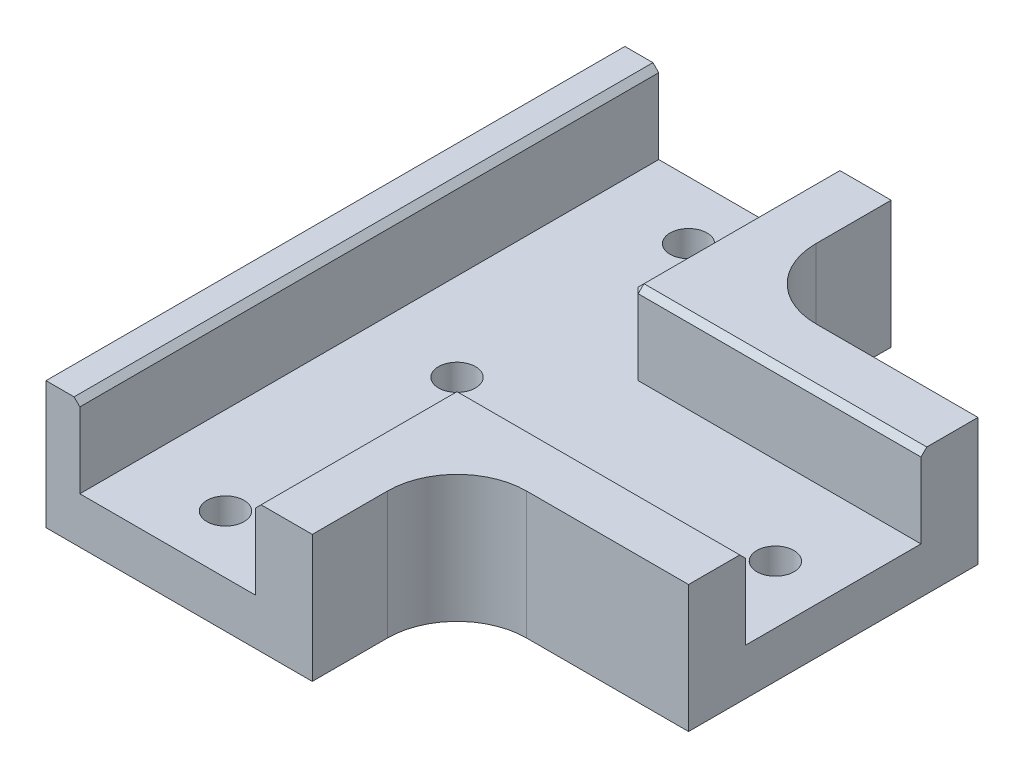
ISO-10303-21;
HEADER;
FILE_DESCRIPTION(('STEP AP214'),'2;1');
FILE_NAME('part.step','',(''),(''),'','','');
FILE_SCHEMA(('AUTOMOTIVE_DESIGN { 1 0 10303 214 1 1 1 1 }'));
ENDSEC;
DATA;
#1=APPLICATION_CONTEXT('core data for automotive mechanical design processes');
#2=APPLICATION_PROTOCOL_DEFINITION('international standard','automotive_design',2000,#1);
#3=PRODUCT_CONTEXT('',#1,'mechanical');
#4=PRODUCT('Part','Part','',(#3));
#5=PRODUCT_RELATED_PRODUCT_CATEGORY('part','',(#4));
#6=PRODUCT_DEFINITION_FORMATION('','',#4);
#7=PRODUCT_DEFINITION_CONTEXT('part definition',#1,'design');
#8=PRODUCT_DEFINITION('design','',#6,#7);
#9=PRODUCT_DEFINITION_SHAPE('','',#8);
#10=(LENGTH_UNIT() NAMED_UNIT(*) SI_UNIT(.MILLI.,.METRE.));
#11=(NAMED_UNIT(*) PLANE_ANGLE_UNIT() SI_UNIT($,.RADIAN.));
#12=(NAMED_UNIT(*) SI_UNIT($,.STERADIAN.) SOLID_ANGLE_UNIT());
#13=UNCERTAINTY_MEASURE_WITH_UNIT(LENGTH_MEASURE(1.E-05),#10,'distance_accuracy_value','');
#14=(GEOMETRIC_REPRESENTATION_CONTEXT(3) GLOBAL_UNCERTAINTY_ASSIGNED_CONTEXT((#13)) GLOBAL_UNIT_ASSIGNED_CONTEXT((#10,
#11,#12)) REPRESENTATION_CONTEXT('',''));
#15=CARTESIAN_POINT('',(0.,0.,0.));
#16=DIRECTION('',(0.,0.,1.));
#17=DIRECTION('',(1.,0.,0.));
#18=AXIS2_PLACEMENT_3D('',#15,#16,#17);
#19=CARTESIAN_POINT('',(0.,4.,0.));
#20=DIRECTION('',(0.,-1.,0.));
#21=DIRECTION('',(0.,0.,-1.));
#22=AXIS2_PLACEMENT_3D('',#19,#20,#21);
#23=PLANE('',#22);
#24=CARTESIAN_POINT('',(0.,4.,-20.));
#25=DIRECTION('',(0.,1.,0.));
#26=DIRECTION('',(0.,0.,1.));
#27=AXIS2_PLACEMENT_3D('',#24,#25,#26);
#28=CIRCLE('',#27,1.6);
#29=CARTESIAN_POINT('',(0.,4.,-18.4));
#30=VERTEX_POINT('',#29);
#31=EDGE_CURVE('E802',#30,#30,#28,.T.);
#32=ORIENTED_EDGE('',*,*,#31,.F.);
#33=EDGE_LOOP('',(#32));
#34=FACE_BOUND('',#33,.T.);
#35=CARTESIAN_POINT('',(0.,4.,20.));
#36=DIRECTION('',(0.,1.,0.));
#37=DIRECTION('',(0.,0.,1.));
#38=AXIS2_PLACEMENT_3D('',#35,#36,#37);
#39=CIRCLE('',#38,1.6);
#40=CARTESIAN_POINT('',(0.,4.,21.6));
#41=VERTEX_POINT('',#40);
#42=EDGE_CURVE('E808',#41,#41,#39,.T.);
#43=ORIENTED_EDGE('',*,*,#42,.F.);
#44=EDGE_LOOP('',(#43));
#45=FACE_BOUND('',#44,.T.);
#46=CARTESIAN_POINT('',(27.5,4.,0.));
#47=DIRECTION('',(0.,1.,0.));
#48=DIRECTION('',(0.,0.,1.));
#49=AXIS2_PLACEMENT_3D('',#46,#47,#48);
#50=CIRCLE('',#49,1.6);
#51=CARTESIAN_POINT('',(27.5,4.,1.6));
#52=VERTEX_POINT('',#51);
#53=EDGE_CURVE('E365',#52,#52,#50,.T.);
#54=ORIENTED_EDGE('',*,*,#53,.F.);
#55=EDGE_LOOP('',(#54));
#56=FACE_BOUND('',#55,.T.);
#57=CARTESIAN_POINT('',(0.,4.,0.));
#58=DIRECTION('',(0.,1.,0.));
#59=DIRECTION('',(0.,0.,1.));
#60=AXIS2_PLACEMENT_3D('',#57,#58,#59);
#61=CIRCLE('',#60,1.6);
#62=CARTESIAN_POINT('',(0.,4.,1.6));
#63=VERTEX_POINT('',#62);
#64=EDGE_CURVE('E805',#63,#63,#61,.T.);
#65=ORIENTED_EDGE('',*,*,#64,.F.);
#66=EDGE_LOOP('',(#65));
#67=FACE_BOUND('',#66,.T.);
#68=DIRECTION('',(0.,0.,-1.));
#69=VECTOR('',#68,1.);
#70=CARTESIAN_POINT('',(-7.57500000000001,4.,-25.));
#71=LINE('',#70,#69);
#72=CARTESIAN_POINT('',(-7.575,4.,25.));
#73=VERTEX_POINT('',#72);
#74=CARTESIAN_POINT('',(-7.575,4.,-25.));
#75=VERTEX_POINT('',#74);
#76=EDGE_CURVE('E206',#73,#75,#71,.T.);
#77=ORIENTED_EDGE('',*,*,#76,.F.);
#78=DIRECTION('',(1.,0.,0.));
#79=VECTOR('',#78,1.);
#80=CARTESIAN_POINT('',(12.5,4.,25.));
#81=LINE('',#80,#79);
#82=CARTESIAN_POINT('',(7.57500000000001,4.,25.));
#83=VERTEX_POINT('',#82);
#84=EDGE_CURVE('E280',#73,#83,#81,.T.);
#85=ORIENTED_EDGE('',*,*,#84,.T.);
#86=DIRECTION('',(0.,0.,1.));
#87=VECTOR('',#86,1.);
#88=CARTESIAN_POINT('',(7.57500000000001,4.,25.));
#89=LINE('',#88,#87);
#90=CARTESIAN_POINT('',(7.575,4.,8.07500000000001));
#91=VERTEX_POINT('',#90);
#92=EDGE_CURVE('E257',#91,#83,#89,.T.);
#93=ORIENTED_EDGE('',*,*,#92,.F.);
#94=DIRECTION('',(-0.707106781186548,0.,0.707106781186548));
#95=VECTOR('',#94,1.);
#96=CARTESIAN_POINT('',(7.825,4.,7.825));
#97=LINE('',#96,#95);
#98=CARTESIAN_POINT('',(8.07500000000001,4.,7.575));
#99=VERTEX_POINT('',#98);
#100=EDGE_CURVE('E350',#91,#99,#97,.F.);
#101=ORIENTED_EDGE('',*,*,#100,.T.);
#102=DIRECTION('',(-1.,0.,0.));
#103=VECTOR('',#102,1.);
#104=CARTESIAN_POINT('',(7.575,4.,7.575));
#105=LINE('',#104,#103);
#106=CARTESIAN_POINT('',(32.5,4.,7.57500000000001));
#107=VERTEX_POINT('',#106);
#108=EDGE_CURVE('E253',#107,#99,#105,.T.);
#109=ORIENTED_EDGE('',*,*,#108,.F.);
#110=DIRECTION('',(0.,0.,-1.));
#111=VECTOR('',#110,1.);
#112=CARTESIAN_POINT('',(32.5,4.,-12.5));
#113=LINE('',#112,#111);
#114=CARTESIAN_POINT('',(32.5,4.,-7.575));
#115=VERTEX_POINT('',#114);
#116=EDGE_CURVE('E273',#107,#115,#113,.T.);
#117=ORIENTED_EDGE('',*,*,#116,.T.);
#118=DIRECTION('',(1.,0.,0.));
#119=VECTOR('',#118,1.);
#120=CARTESIAN_POINT('',(32.5,4.,-7.57500000000001));
#121=LINE('',#120,#119);
#122=CARTESIAN_POINT('',(8.07500000000001,4.,-7.575));
#123=VERTEX_POINT('',#122);
#124=EDGE_CURVE('E237',#123,#115,#121,.T.);
#125=ORIENTED_EDGE('',*,*,#124,.F.);
#126=DIRECTION('',(0.707106781186546,0.,0.707106781186549));
#127=VECTOR('',#126,1.);
#128=CARTESIAN_POINT('',(7.82500000000002,4.,-7.82499999999999));
#129=LINE('',#128,#127);
#130=CARTESIAN_POINT('',(7.575,4.,-8.07500000000001));
#131=VERTEX_POINT('',#130);
#132=EDGE_CURVE('E352',#123,#131,#129,.F.);
#133=ORIENTED_EDGE('',*,*,#132,.T.);
#134=DIRECTION('',(0.,0.,1.));
#135=VECTOR('',#134,1.);
#136=CARTESIAN_POINT('',(7.575,4.,-7.575));
#137=LINE('',#136,#135);
#138=CARTESIAN_POINT('',(7.575,4.,-25.));
#139=VERTEX_POINT('',#138);
#140=EDGE_CURVE('E233',#139,#131,#137,.T.);
#141=ORIENTED_EDGE('',*,*,#140,.F.);
#142=DIRECTION('',(-1.,0.,0.));
#143=VECTOR('',#142,1.);
#144=CARTESIAN_POINT('',(-10.5,4.,-25.));
#145=LINE('',#144,#143);
#146=EDGE_CURVE('E276',#139,#75,#145,.T.);
#147=ORIENTED_EDGE('',*,*,#146,.T.);
#148=EDGE_LOOP('',(#77,#85,#93,#101,#109,#117,#125,#133,#141,#147));
#149=FACE_BOUND('',#148,.T.);
#150=ADVANCED_FACE('F34',(#34,#45,#56,#67,#149),#23,.F.);
#151=CARTESIAN_POINT('',(32.5,4.,-12.5));
#152=DIRECTION('',(-1.,0.,0.));
#153=DIRECTION('',(0.,0.,1.));
#154=AXIS2_PLACEMENT_3D('',#151,#152,#153);
#155=PLANE('',#154);
#156=DIRECTION('',(0.,-1.,0.));
#157=VECTOR('',#156,1.);
#158=CARTESIAN_POINT('',(32.5,11.,7.57500000000001));
#159=LINE('',#158,#157);
#160=CARTESIAN_POINT('',(32.5,10.5,7.57500000000001));
#161=VERTEX_POINT('',#160);
#162=EDGE_CURVE('E270',#161,#107,#159,.T.);
#163=ORIENTED_EDGE('',*,*,#162,.F.);
#164=DIRECTION('',(0.,0.707106781186547,0.707106781186548));
#165=VECTOR('',#164,1.);
#166=CARTESIAN_POINT('',(32.5,11.,8.07500000000001));
#167=LINE('',#166,#165);
#168=CARTESIAN_POINT('',(32.5,11.,8.07500000000001));
#169=VERTEX_POINT('',#168);
#170=EDGE_CURVE('E328',#161,#169,#167,.T.);
#171=ORIENTED_EDGE('',*,*,#170,.T.);
#172=DIRECTION('',(0.,0.,-1.));
#173=VECTOR('',#172,1.);
#174=CARTESIAN_POINT('',(32.5,11.,12.5));
#175=LINE('',#174,#173);
#176=CARTESIAN_POINT('',(32.5,11.,12.5));
#177=VERTEX_POINT('',#176);
#178=EDGE_CURVE('E256',#177,#169,#175,.T.);
#179=ORIENTED_EDGE('',*,*,#178,.F.);
#180=DIRECTION('',(0.,-1.,0.));
#181=VECTOR('',#180,1.);
#182=CARTESIAN_POINT('',(32.5,4.,12.5));
#183=LINE('',#182,#181);
#184=CARTESIAN_POINT('',(32.5,0.,12.5));
#185=VERTEX_POINT('',#184);
#186=EDGE_CURVE('E283',#177,#185,#183,.T.);
#187=ORIENTED_EDGE('',*,*,#186,.T.);
#188=DIRECTION('',(0.,0.,-1.));
#189=VECTOR('',#188,1.);
#190=CARTESIAN_POINT('',(32.5,0.,-12.5));
#191=LINE('',#190,#189);
#192=CARTESIAN_POINT('',(32.5,0.,-12.5));
#193=VERTEX_POINT('',#192);
#194=EDGE_CURVE('E272',#185,#193,#191,.T.);
#195=ORIENTED_EDGE('',*,*,#194,.T.);
#196=DIRECTION('',(0.,-1.,0.));
#197=VECTOR('',#196,1.);
#198=CARTESIAN_POINT('',(32.5,4.,-12.5));
#199=LINE('',#198,#197);
#200=CARTESIAN_POINT('',(32.5,11.,-12.5));
#201=VERTEX_POINT('',#200);
#202=EDGE_CURVE('E306',#201,#193,#199,.T.);
#203=ORIENTED_EDGE('',*,*,#202,.F.);
#204=DIRECTION('',(0.,0.,-1.));
#205=VECTOR('',#204,1.);
#206=CARTESIAN_POINT('',(32.5,11.,-7.57500000000001));
#207=LINE('',#206,#205);
#208=CARTESIAN_POINT('',(32.5,11.,-8.07500000000002));
#209=VERTEX_POINT('',#208);
#210=EDGE_CURVE('E234',#209,#201,#207,.T.);
#211=ORIENTED_EDGE('',*,*,#210,.F.);
#212=DIRECTION('',(0.,-0.707106781186548,0.707106781186547));
#213=VECTOR('',#212,1.);
#214=CARTESIAN_POINT('',(32.5,11.,-8.07500000000001));
#215=LINE('',#214,#213);
#216=CARTESIAN_POINT('',(32.5,10.5,-7.57500000000001));
#217=VERTEX_POINT('',#216);
#218=EDGE_CURVE('E326',#209,#217,#215,.T.);
#219=ORIENTED_EDGE('',*,*,#218,.T.);
#220=DIRECTION('',(0.,-1.,0.));
#221=VECTOR('',#220,1.);
#222=CARTESIAN_POINT('',(32.5,11.,-7.57500000000001));
#223=LINE('',#222,#221);
#224=EDGE_CURVE('E245',#217,#115,#223,.T.);
#225=ORIENTED_EDGE('',*,*,#224,.T.);
#226=ORIENTED_EDGE('',*,*,#116,.F.);
#227=EDGE_LOOP('',(#163,#171,#179,#187,#195,#203,#211,#219,#225,#226));
#228=FACE_BOUND('',#227,.T.);
#229=ADVANCED_FACE('F407',(#228),#155,.F.);
#230=CARTESIAN_POINT('',(12.5,4.,-12.5));
#231=DIRECTION('',(0.,0.,1.));
#232=DIRECTION('',(1.,0.,0.));
#233=AXIS2_PLACEMENT_3D('',#230,#231,#232);
#234=PLANE('',#233);
#235=DIRECTION('',(-1.,0.,0.));
#236=VECTOR('',#235,1.);
#237=CARTESIAN_POINT('',(12.5,0.,-12.5));
#238=LINE('',#237,#236);
#239=CARTESIAN_POINT('',(18.5,0.,-12.5));
#240=VERTEX_POINT('',#239);
#241=EDGE_CURVE('E286',#193,#240,#238,.T.);
#242=ORIENTED_EDGE('',*,*,#241,.T.);
#243=DIRECTION('',(0.,-1.,0.));
#244=VECTOR('',#243,1.);
#245=CARTESIAN_POINT('',(18.5,11.,-12.5));
#246=LINE('',#245,#244);
#247=CARTESIAN_POINT('',(18.5,11.,-12.5));
#248=VERTEX_POINT('',#247);
#249=EDGE_CURVE('E376',#240,#248,#246,.F.);
#250=ORIENTED_EDGE('',*,*,#249,.T.);
#251=DIRECTION('',(-1.,0.,0.));
#252=VECTOR('',#251,1.);
#253=CARTESIAN_POINT('',(32.5,11.,-12.5));
#254=LINE('',#253,#252);
#255=EDGE_CURVE('E236',#201,#248,#254,.T.);
#256=ORIENTED_EDGE('',*,*,#255,.F.);
#257=ORIENTED_EDGE('',*,*,#202,.T.);
#258=EDGE_LOOP('',(#242,#250,#256,#257));
#259=FACE_BOUND('',#258,.T.);
#260=ADVANCED_FACE('F402',(#259),#234,.F.);
#261=CARTESIAN_POINT('',(12.5,4.,-25.));
#262=DIRECTION('',(-1.,0.,0.));
#263=DIRECTION('',(0.,0.,1.));
#264=AXIS2_PLACEMENT_3D('',#261,#262,#263);
#265=PLANE('',#264);
#266=DIRECTION('',(0.,0.,-1.));
#267=VECTOR('',#266,1.);
#268=CARTESIAN_POINT('',(12.5,11.,-12.5));
#269=LINE('',#268,#267);
#270=CARTESIAN_POINT('',(12.5,11.,-18.5));
#271=VERTEX_POINT('',#270);
#272=CARTESIAN_POINT('',(12.5,11.,-25.));
#273=VERTEX_POINT('',#272);
#274=EDGE_CURVE('E240',#271,#273,#269,.T.);
#275=ORIENTED_EDGE('',*,*,#274,.F.);
#276=DIRECTION('',(0.,-1.,0.));
#277=VECTOR('',#276,1.);
#278=CARTESIAN_POINT('',(12.5,0.,-18.5));
#279=LINE('',#278,#277);
#280=CARTESIAN_POINT('',(12.5,0.,-18.5));
#281=VERTEX_POINT('',#280);
#282=EDGE_CURVE('E354',#271,#281,#279,.T.);
#283=ORIENTED_EDGE('',*,*,#282,.T.);
#284=DIRECTION('',(0.,0.,-1.));
#285=VECTOR('',#284,1.);
#286=CARTESIAN_POINT('',(12.5,0.,-25.));
#287=LINE('',#286,#285);
#288=CARTESIAN_POINT('',(12.5,0.,-25.));
#289=VERTEX_POINT('',#288);
#290=EDGE_CURVE('E289',#281,#289,#287,.T.);
#291=ORIENTED_EDGE('',*,*,#290,.T.);
#292=DIRECTION('',(0.,-1.,0.));
#293=VECTOR('',#292,1.);
#294=CARTESIAN_POINT('',(12.5,4.,-25.));
#295=LINE('',#294,#293);
#296=EDGE_CURVE('E216',#273,#289,#295,.T.);
#297=ORIENTED_EDGE('',*,*,#296,.F.);
#298=EDGE_LOOP('',(#275,#283,#291,#297));
#299=FACE_BOUND('',#298,.T.);
#300=ADVANCED_FACE('F395',(#299),#265,.F.);
#301=CARTESIAN_POINT('',(-10.5,4.,-25.));
#302=DIRECTION('',(0.,0.,1.));
#303=DIRECTION('',(1.,0.,0.));
#304=AXIS2_PLACEMENT_3D('',#301,#302,#303);
#305=PLANE('',#304);
#306=DIRECTION('',(-1.,0.,0.));
#307=VECTOR('',#306,1.);
#308=CARTESIAN_POINT('',(-7.57500000000001,11.,-25.));
#309=LINE('',#308,#307);
#310=CARTESIAN_POINT('',(-8.07500000000001,11.,-25.));
#311=VERTEX_POINT('',#310);
#312=CARTESIAN_POINT('',(-10.5,11.,-25.));
#313=VERTEX_POINT('',#312);
#314=EDGE_CURVE('E196',#311,#313,#309,.T.);
#315=ORIENTED_EDGE('',*,*,#314,.F.);
#316=DIRECTION('',(0.707106781186548,-0.707106781186548,0.));
#317=VECTOR('',#316,1.);
#318=CARTESIAN_POINT('',(-8.07500000000001,11.,-25.));
#319=LINE('',#318,#317);
#320=CARTESIAN_POINT('',(-7.57500000000001,10.5,-25.));
#321=VERTEX_POINT('',#320);
#322=EDGE_CURVE('E333',#311,#321,#319,.T.);
#323=ORIENTED_EDGE('',*,*,#322,.T.);
#324=DIRECTION('',(0.,-1.,0.));
#325=VECTOR('',#324,1.);
#326=CARTESIAN_POINT('',(-7.57500000000001,11.,-25.));
#327=LINE('',#326,#325);
#328=EDGE_CURVE('E223',#321,#75,#327,.T.);
#329=ORIENTED_EDGE('',*,*,#328,.T.);
#330=ORIENTED_EDGE('',*,*,#146,.F.);
#331=DIRECTION('',(0.,-1.,0.));
#332=VECTOR('',#331,1.);
#333=CARTESIAN_POINT('',(7.575,11.,-25.));
#334=LINE('',#333,#332);
#335=CARTESIAN_POINT('',(7.575,10.5,-25.));
#336=VERTEX_POINT('',#335);
#337=EDGE_CURVE('E251',#336,#139,#334,.T.);
#338=ORIENTED_EDGE('',*,*,#337,.F.);
#339=DIRECTION('',(0.707106781186548,0.707106781186547,0.));
#340=VECTOR('',#339,1.);
#341=CARTESIAN_POINT('',(8.07500000000001,11.,-25.));
#342=LINE('',#341,#340);
#343=CARTESIAN_POINT('',(8.07500000000001,11.,-25.));
#344=VERTEX_POINT('',#343);
#345=EDGE_CURVE('E331',#336,#344,#342,.T.);
#346=ORIENTED_EDGE('',*,*,#345,.T.);
#347=DIRECTION('',(-1.,0.,0.));
#348=VECTOR('',#347,1.);
#349=CARTESIAN_POINT('',(12.5,11.,-25.));
#350=LINE('',#349,#348);
#351=EDGE_CURVE('E242',#273,#344,#350,.T.);
#352=ORIENTED_EDGE('',*,*,#351,.F.);
#353=ORIENTED_EDGE('',*,*,#296,.T.);
#354=DIRECTION('',(-1.,0.,0.));
#355=VECTOR('',#354,1.);
#356=CARTESIAN_POINT('',(-10.5,0.,-25.));
#357=LINE('',#356,#355);
#358=CARTESIAN_POINT('',(-10.5,0.,-25.));
#359=VERTEX_POINT('',#358);
#360=EDGE_CURVE('E213',#289,#359,#357,.T.);
#361=ORIENTED_EDGE('',*,*,#360,.T.);
#362=DIRECTION('',(0.,-1.,0.));
#363=VECTOR('',#362,1.);
#364=CARTESIAN_POINT('',(-10.5,4.,-25.));
#365=LINE('',#364,#363);
#366=EDGE_CURVE('E209',#313,#359,#365,.T.);
#367=ORIENTED_EDGE('',*,*,#366,.F.);
#368=EDGE_LOOP('',(#315,#323,#329,#330,#338,#346,#352,#353,#361,#367));
#369=FACE_BOUND('',#368,.T.);
#370=ADVANCED_FACE('F210',(#369),#305,.F.);
#371=CARTESIAN_POINT('',(-10.5,4.,-25.));
#372=DIRECTION('',(1.,0.,0.));
#373=DIRECTION('',(0.,0.,-1.));
#374=AXIS2_PLACEMENT_3D('',#371,#372,#373);
#375=PLANE('',#374);
#376=DIRECTION('',(0.,0.,1.));
#377=VECTOR('',#376,1.);
#378=CARTESIAN_POINT('',(-10.5,0.,-25.));
#379=LINE('',#378,#377);
#380=CARTESIAN_POINT('',(-10.5,0.,25.));
#381=VERTEX_POINT('',#380);
#382=EDGE_CURVE('E292',#359,#381,#379,.T.);
#383=ORIENTED_EDGE('',*,*,#382,.T.);
#384=DIRECTION('',(0.,-1.,0.));
#385=VECTOR('',#384,1.);
#386=CARTESIAN_POINT('',(-10.5,4.,25.));
#387=LINE('',#386,#385);
#388=CARTESIAN_POINT('',(-10.5,11.,25.));
#389=VERTEX_POINT('',#388);
#390=EDGE_CURVE('E217',#389,#381,#387,.T.);
#391=ORIENTED_EDGE('',*,*,#390,.F.);
#392=DIRECTION('',(0.,0.,1.));
#393=VECTOR('',#392,1.);
#394=CARTESIAN_POINT('',(-10.5,11.,-25.));
#395=LINE('',#394,#393);
#396=EDGE_CURVE('E201',#313,#389,#395,.T.);
#397=ORIENTED_EDGE('',*,*,#396,.F.);
#398=ORIENTED_EDGE('',*,*,#366,.T.);
#399=EDGE_LOOP('',(#383,#391,#397,#398));
#400=FACE_BOUND('',#399,.T.);
#401=ADVANCED_FACE('F219',(#400),#375,.F.);
#402=CARTESIAN_POINT('',(12.5,4.,25.));
#403=DIRECTION('',(0.,0.,-1.));
#404=DIRECTION('',(-1.,0.,0.));
#405=AXIS2_PLACEMENT_3D('',#402,#403,#404);
#406=PLANE('',#405);
#407=DIRECTION('',(1.,0.,0.));
#408=VECTOR('',#407,1.);
#409=CARTESIAN_POINT('',(7.57500000000001,11.,25.));
#410=LINE('',#409,#408);
#411=CARTESIAN_POINT('',(8.07500000000001,11.,25.));
#412=VERTEX_POINT('',#411);
#413=CARTESIAN_POINT('',(12.5,11.,25.));
#414=VERTEX_POINT('',#413);
#415=EDGE_CURVE('E260',#412,#414,#410,.T.);
#416=ORIENTED_EDGE('',*,*,#415,.F.);
#417=DIRECTION('',(-0.707106781186548,-0.707106781186547,0.));
#418=VECTOR('',#417,1.);
#419=CARTESIAN_POINT('',(8.07500000000001,11.,25.));
#420=LINE('',#419,#418);
#421=CARTESIAN_POINT('',(7.57500000000001,10.5,25.));
#422=VERTEX_POINT('',#421);
#423=EDGE_CURVE('E324',#412,#422,#420,.T.);
#424=ORIENTED_EDGE('',*,*,#423,.T.);
#425=DIRECTION('',(0.,-1.,0.));
#426=VECTOR('',#425,1.);
#427=CARTESIAN_POINT('',(7.57500000000001,11.,25.));
#428=LINE('',#427,#426);
#429=EDGE_CURVE('E264',#422,#83,#428,.T.);
#430=ORIENTED_EDGE('',*,*,#429,.T.);
#431=ORIENTED_EDGE('',*,*,#84,.F.);
#432=DIRECTION('',(0.,-1.,0.));
#433=VECTOR('',#432,1.);
#434=CARTESIAN_POINT('',(-7.575,11.,25.));
#435=LINE('',#434,#433);
#436=CARTESIAN_POINT('',(-7.575,10.5,25.));
#437=VERTEX_POINT('',#436);
#438=EDGE_CURVE('E231',#437,#73,#435,.T.);
#439=ORIENTED_EDGE('',*,*,#438,.F.);
#440=DIRECTION('',(-0.707106781186548,0.707106781186548,0.));
#441=VECTOR('',#440,1.);
#442=CARTESIAN_POINT('',(-8.075,11.,25.));
#443=LINE('',#442,#441);
#444=CARTESIAN_POINT('',(-8.075,11.,25.));
#445=VERTEX_POINT('',#444);
#446=EDGE_CURVE('E322',#437,#445,#443,.T.);
#447=ORIENTED_EDGE('',*,*,#446,.T.);
#448=DIRECTION('',(1.,0.,0.));
#449=VECTOR('',#448,1.);
#450=CARTESIAN_POINT('',(-10.5,11.,25.));
#451=LINE('',#450,#449);
#452=EDGE_CURVE('E221',#389,#445,#451,.T.);
#453=ORIENTED_EDGE('',*,*,#452,.F.);
#454=ORIENTED_EDGE('',*,*,#390,.T.);
#455=DIRECTION('',(1.,0.,0.));
#456=VECTOR('',#455,1.);
#457=CARTESIAN_POINT('',(12.5,0.,25.));
#458=LINE('',#457,#456);
#459=CARTESIAN_POINT('',(12.5,0.,25.));
#460=VERTEX_POINT('',#459);
#461=EDGE_CURVE('E294',#381,#460,#458,.T.);
#462=ORIENTED_EDGE('',*,*,#461,.T.);
#463=DIRECTION('',(0.,-1.,0.));
#464=VECTOR('',#463,1.);
#465=CARTESIAN_POINT('',(12.5,4.,25.));
#466=LINE('',#465,#464);
#467=EDGE_CURVE('E301',#414,#460,#466,.T.);
#468=ORIENTED_EDGE('',*,*,#467,.F.);
#469=EDGE_LOOP('',(#416,#424,#430,#431,#439,#447,#453,#454,#462,#468));
#470=FACE_BOUND('',#469,.T.);
#471=ADVANCED_FACE('F423',(#470),#406,.F.);
#472=CARTESIAN_POINT('',(12.5,4.,12.5));
#473=DIRECTION('',(-1.,0.,0.));
#474=DIRECTION('',(0.,0.,1.));
#475=AXIS2_PLACEMENT_3D('',#472,#473,#474);
#476=PLANE('',#475);
#477=DIRECTION('',(0.,0.,-1.));
#478=VECTOR('',#477,1.);
#479=CARTESIAN_POINT('',(12.5,0.,12.5));
#480=LINE('',#479,#478);
#481=CARTESIAN_POINT('',(12.5,0.,18.5));
#482=VERTEX_POINT('',#481);
#483=EDGE_CURVE('E296',#460,#482,#480,.T.);
#484=ORIENTED_EDGE('',*,*,#483,.T.);
#485=DIRECTION('',(0.,-1.,0.));
#486=VECTOR('',#485,1.);
#487=CARTESIAN_POINT('',(12.5,11.,18.5));
#488=LINE('',#487,#486);
#489=CARTESIAN_POINT('',(12.5,11.,18.5));
#490=VERTEX_POINT('',#489);
#491=EDGE_CURVE('E49',#482,#490,#488,.F.);
#492=ORIENTED_EDGE('',*,*,#491,.T.);
#493=DIRECTION('',(0.,0.,-1.));
#494=VECTOR('',#493,1.);
#495=CARTESIAN_POINT('',(12.5,11.,25.));
#496=LINE('',#495,#494);
#497=EDGE_CURVE('E262',#414,#490,#496,.T.);
#498=ORIENTED_EDGE('',*,*,#497,.F.);
#499=ORIENTED_EDGE('',*,*,#467,.T.);
#500=EDGE_LOOP('',(#484,#492,#498,#499));
#501=FACE_BOUND('',#500,.T.);
#502=ADVANCED_FACE('F420',(#501),#476,.F.);
#503=CARTESIAN_POINT('',(32.5,4.,12.5));
#504=DIRECTION('',(0.,0.,-1.));
#505=DIRECTION('',(-1.,0.,0.));
#506=AXIS2_PLACEMENT_3D('',#503,#504,#505);
#507=PLANE('',#506);
#508=DIRECTION('',(1.,0.,0.));
#509=VECTOR('',#508,1.);
#510=CARTESIAN_POINT('',(12.5,11.,12.5));
#511=LINE('',#510,#509);
#512=CARTESIAN_POINT('',(18.5,11.,12.5));
#513=VERTEX_POINT('',#512);
#514=EDGE_CURVE('E254',#513,#177,#511,.T.);
#515=ORIENTED_EDGE('',*,*,#514,.F.);
#516=DIRECTION('',(0.,-1.,0.));
#517=VECTOR('',#516,1.);
#518=CARTESIAN_POINT('',(18.5,0.,12.5));
#519=LINE('',#518,#517);
#520=CARTESIAN_POINT('',(18.5,0.,12.5));
#521=VERTEX_POINT('',#520);
#522=EDGE_CURVE('E378',#513,#521,#519,.T.);
#523=ORIENTED_EDGE('',*,*,#522,.T.);
#524=DIRECTION('',(1.,0.,0.));
#525=VECTOR('',#524,1.);
#526=CARTESIAN_POINT('',(32.5,0.,12.5));
#527=LINE('',#526,#525);
#528=EDGE_CURVE('E277',#521,#185,#527,.T.);
#529=ORIENTED_EDGE('',*,*,#528,.T.);
#530=ORIENTED_EDGE('',*,*,#186,.F.);
#531=EDGE_LOOP('',(#515,#523,#529,#530));
#532=FACE_BOUND('',#531,.T.);
#533=ADVANCED_FACE('F412',(#532),#507,.F.);
#534=CARTESIAN_POINT('',(0.,0.,0.));
#535=DIRECTION('',(0.,-1.,0.));
#536=DIRECTION('',(0.,0.,-1.));
#537=AXIS2_PLACEMENT_3D('',#534,#535,#536);
#538=PLANE('',#537);
#539=CARTESIAN_POINT('',(0.,0.,-20.));
#540=DIRECTION('',(0.,1.,0.));
#541=DIRECTION('',(0.,0.,1.));
#542=AXIS2_PLACEMENT_3D('',#539,#540,#541);
#543=CIRCLE('',#542,1.6);
#544=CARTESIAN_POINT('',(0.,0.,-18.4));
#545=VERTEX_POINT('',#544);
#546=EDGE_CURVE('E800',#545,#545,#543,.T.);
#547=ORIENTED_EDGE('',*,*,#546,.T.);
#548=EDGE_LOOP('',(#547));
#549=FACE_BOUND('',#548,.T.);
#550=CARTESIAN_POINT('',(0.,0.,20.));
#551=DIRECTION('',(0.,1.,0.));
#552=DIRECTION('',(0.,0.,1.));
#553=AXIS2_PLACEMENT_3D('',#550,#551,#552);
#554=CIRCLE('',#553,1.6);
#555=CARTESIAN_POINT('',(0.,0.,21.6));
#556=VERTEX_POINT('',#555);
#557=EDGE_CURVE('E803',#556,#556,#554,.T.);
#558=ORIENTED_EDGE('',*,*,#557,.T.);
#559=EDGE_LOOP('',(#558));
#560=FACE_BOUND('',#559,.T.);
#561=CARTESIAN_POINT('',(27.5,0.,0.));
#562=DIRECTION('',(0.,1.,0.));
#563=DIRECTION('',(0.,0.,1.));
#564=AXIS2_PLACEMENT_3D('',#561,#562,#563);
#565=CIRCLE('',#564,1.6);
#566=CARTESIAN_POINT('',(27.5,0.,1.6));
#567=VERTEX_POINT('',#566);
#568=EDGE_CURVE('E813',#567,#567,#565,.T.);
#569=ORIENTED_EDGE('',*,*,#568,.T.);
#570=EDGE_LOOP('',(#569));
#571=FACE_BOUND('',#570,.T.);
#572=CARTESIAN_POINT('',(0.,0.,0.));
#573=DIRECTION('',(0.,1.,0.));
#574=DIRECTION('',(0.,0.,1.));
#575=AXIS2_PLACEMENT_3D('',#572,#573,#574);
#576=CIRCLE('',#575,1.6);
#577=CARTESIAN_POINT('',(0.,0.,1.6));
#578=VERTEX_POINT('',#577);
#579=EDGE_CURVE('E229',#578,#578,#576,.T.);
#580=ORIENTED_EDGE('',*,*,#579,.T.);
#581=EDGE_LOOP('',(#580));
#582=FACE_BOUND('',#581,.T.);
#583=ORIENTED_EDGE('',*,*,#194,.F.);
#584=ORIENTED_EDGE('',*,*,#528,.F.);
#585=CARTESIAN_POINT('',(18.5,0.,18.5));
#586=DIRECTION('',(0.,-1.,0.));
#587=DIRECTION('',(0.,0.,-1.));
#588=AXIS2_PLACEMENT_3D('',#585,#586,#587);
#589=CIRCLE('',#588,6.);
#590=EDGE_CURVE('E42',#521,#482,#589,.F.);
#591=ORIENTED_EDGE('',*,*,#590,.T.);
#592=ORIENTED_EDGE('',*,*,#483,.F.);
#593=ORIENTED_EDGE('',*,*,#461,.F.);
#594=ORIENTED_EDGE('',*,*,#382,.F.);
#595=ORIENTED_EDGE('',*,*,#360,.F.);
#596=ORIENTED_EDGE('',*,*,#290,.F.);
#597=CARTESIAN_POINT('',(18.5,0.,-18.5));
#598=DIRECTION('',(0.,-1.,0.));
#599=DIRECTION('',(0.,0.,-1.));
#600=AXIS2_PLACEMENT_3D('',#597,#598,#599);
#601=CIRCLE('',#600,6.);
#602=EDGE_CURVE('E382',#281,#240,#601,.F.);
#603=ORIENTED_EDGE('',*,*,#602,.T.);
#604=ORIENTED_EDGE('',*,*,#241,.F.);
#605=EDGE_LOOP('',(#583,#584,#591,#592,#593,#594,#595,#596,#603,#604));
#606=FACE_BOUND('',#605,.T.);
#607=ADVANCED_FACE('F400',(#549,#560,#571,#582,#606),#538,.T.);
#608=CARTESIAN_POINT('',(7.575,11.,7.575));
#609=DIRECTION('',(0.,0.,1.));
#610=DIRECTION('',(1.,0.,0.));
#611=AXIS2_PLACEMENT_3D('',#608,#609,#610);
#612=PLANE('',#611);
#613=ORIENTED_EDGE('',*,*,#108,.T.);
#614=DIRECTION('',(0.,1.,0.));
#615=VECTOR('',#614,1.);
#616=CARTESIAN_POINT('',(8.07500000000001,11.,7.575));
#617=LINE('',#616,#615);
#618=CARTESIAN_POINT('',(8.07500000000001,10.5,7.575));
#619=VERTEX_POINT('',#618);
#620=EDGE_CURVE('E316',#99,#619,#617,.T.);
#621=ORIENTED_EDGE('',*,*,#620,.T.);
#622=DIRECTION('',(1.,0.,0.));
#623=VECTOR('',#622,1.);
#624=CARTESIAN_POINT('',(32.5,10.5,7.57500000000001));
#625=LINE('',#624,#623);
#626=EDGE_CURVE('E314',#619,#161,#625,.T.);
#627=ORIENTED_EDGE('',*,*,#626,.T.);
#628=ORIENTED_EDGE('',*,*,#162,.T.);
#629=EDGE_LOOP('',(#613,#621,#627,#628));
#630=FACE_BOUND('',#629,.T.);
#631=ADVANCED_FACE('F480',(#630),#612,.F.);
#632=CARTESIAN_POINT('',(7.57500000000001,11.,25.));
#633=DIRECTION('',(1.,0.,0.));
#634=DIRECTION('',(0.,0.,-1.));
#635=AXIS2_PLACEMENT_3D('',#632,#633,#634);
#636=PLANE('',#635);
#637=DIRECTION('',(0.,0.,-1.));
#638=VECTOR('',#637,1.);
#639=CARTESIAN_POINT('',(7.575,10.5,7.575));
#640=LINE('',#639,#638);
#641=CARTESIAN_POINT('',(7.575,10.5,8.07500000000001));
#642=VERTEX_POINT('',#641);
#643=EDGE_CURVE('E309',#422,#642,#640,.T.);
#644=ORIENTED_EDGE('',*,*,#643,.T.);
#645=DIRECTION('',(0.,-1.,0.));
#646=VECTOR('',#645,1.);
#647=CARTESIAN_POINT('',(7.575,11.,8.07500000000001));
#648=LINE('',#647,#646);
#649=EDGE_CURVE('E311',#642,#91,#648,.T.);
#650=ORIENTED_EDGE('',*,*,#649,.T.);
#651=ORIENTED_EDGE('',*,*,#92,.T.);
#652=ORIENTED_EDGE('',*,*,#429,.F.);
#653=EDGE_LOOP('',(#644,#650,#651,#652));
#654=FACE_BOUND('',#653,.T.);
#655=ADVANCED_FACE('F476',(#654),#636,.F.);
#656=CARTESIAN_POINT('',(0.,11.,0.));
#657=DIRECTION('',(0.,1.,0.));
#658=DIRECTION('',(0.,0.,1.));
#659=AXIS2_PLACEMENT_3D('',#656,#657,#658);
#660=PLANE('',#659);
#661=DIRECTION('',(-1.,0.,0.));
#662=VECTOR('',#661,1.);
#663=CARTESIAN_POINT('',(7.575,11.,8.07500000000001));
#664=LINE('',#663,#662);
#665=CARTESIAN_POINT('',(8.07500000000001,11.,8.07500000000001));
#666=VERTEX_POINT('',#665);
#667=EDGE_CURVE('E318',#169,#666,#664,.T.);
#668=ORIENTED_EDGE('',*,*,#667,.T.);
#669=DIRECTION('',(0.,0.,1.));
#670=VECTOR('',#669,1.);
#671=CARTESIAN_POINT('',(8.07500000000001,11.,25.));
#672=LINE('',#671,#670);
#673=EDGE_CURVE('E320',#666,#412,#672,.T.);
#674=ORIENTED_EDGE('',*,*,#673,.T.);
#675=ORIENTED_EDGE('',*,*,#415,.T.);
#676=ORIENTED_EDGE('',*,*,#497,.T.);
#677=CARTESIAN_POINT('',(18.5,11.,18.5));
#678=DIRECTION('',(0.,1.,0.));
#679=DIRECTION('',(0.,0.,1.));
#680=AXIS2_PLACEMENT_3D('',#677,#678,#679);
#681=CIRCLE('',#680,6.);
#682=EDGE_CURVE('E11',#490,#513,#681,.F.);
#683=ORIENTED_EDGE('',*,*,#682,.T.);
#684=ORIENTED_EDGE('',*,*,#514,.T.);
#685=ORIENTED_EDGE('',*,*,#178,.T.);
#686=EDGE_LOOP('',(#668,#674,#675,#676,#683,#684,#685));
#687=FACE_BOUND('',#686,.T.);
#688=ADVANCED_FACE('F417',(#687),#660,.T.);
#689=CARTESIAN_POINT('',(7.575,11.,-7.575));
#690=DIRECTION('',(1.,0.,0.));
#691=DIRECTION('',(0.,0.,-1.));
#692=AXIS2_PLACEMENT_3D('',#689,#690,#691);
#693=PLANE('',#692);
#694=ORIENTED_EDGE('',*,*,#140,.T.);
#695=DIRECTION('',(0.,1.,0.));
#696=VECTOR('',#695,1.);
#697=CARTESIAN_POINT('',(7.575,11.,-8.07500000000001));
#698=LINE('',#697,#696);
#699=CARTESIAN_POINT('',(7.575,10.5,-8.07500000000001));
#700=VERTEX_POINT('',#699);
#701=EDGE_CURVE('E344',#131,#700,#698,.T.);
#702=ORIENTED_EDGE('',*,*,#701,.T.);
#703=DIRECTION('',(0.,0.,-1.));
#704=VECTOR('',#703,1.);
#705=CARTESIAN_POINT('',(7.575,10.5,-25.));
#706=LINE('',#705,#704);
#707=EDGE_CURVE('E342',#700,#336,#706,.T.);
#708=ORIENTED_EDGE('',*,*,#707,.T.);
#709=ORIENTED_EDGE('',*,*,#337,.T.);
#710=EDGE_LOOP('',(#694,#702,#708,#709));
#711=FACE_BOUND('',#710,.T.);
#712=ADVANCED_FACE('F571',(#711),#693,.F.);
#713=CARTESIAN_POINT('',(32.5,11.,-7.57500000000001));
#714=DIRECTION('',(0.,0.,-1.));
#715=DIRECTION('',(-1.,0.,0.));
#716=AXIS2_PLACEMENT_3D('',#713,#714,#715);
#717=PLANE('',#716);
#718=DIRECTION('',(-1.,0.,0.));
#719=VECTOR('',#718,1.);
#720=CARTESIAN_POINT('',(7.575,10.5,-7.575));
#721=LINE('',#720,#719);
#722=CARTESIAN_POINT('',(8.07500000000001,10.5,-7.575));
#723=VERTEX_POINT('',#722);
#724=EDGE_CURVE('E337',#217,#723,#721,.T.);
#725=ORIENTED_EDGE('',*,*,#724,.T.);
#726=DIRECTION('',(0.,-1.,0.));
#727=VECTOR('',#726,1.);
#728=CARTESIAN_POINT('',(8.07500000000001,11.,-7.575));
#729=LINE('',#728,#727);
#730=EDGE_CURVE('E339',#723,#123,#729,.T.);
#731=ORIENTED_EDGE('',*,*,#730,.T.);
#732=ORIENTED_EDGE('',*,*,#124,.T.);
#733=ORIENTED_EDGE('',*,*,#224,.F.);
#734=EDGE_LOOP('',(#725,#731,#732,#733));
#735=FACE_BOUND('',#734,.T.);
#736=ADVANCED_FACE('F456',(#735),#717,.F.);
#737=CARTESIAN_POINT('',(0.,11.,0.));
#738=DIRECTION('',(0.,1.,0.));
#739=DIRECTION('',(0.,0.,1.));
#740=AXIS2_PLACEMENT_3D('',#737,#738,#739);
#741=PLANE('',#740);
#742=ORIENTED_EDGE('',*,*,#351,.T.);
#743=DIRECTION('',(0.,0.,1.));
#744=VECTOR('',#743,1.);
#745=CARTESIAN_POINT('',(8.07500000000001,11.,-7.575));
#746=LINE('',#745,#744);
#747=CARTESIAN_POINT('',(8.07500000000001,11.,-8.07500000000001));
#748=VERTEX_POINT('',#747);
#749=EDGE_CURVE('E348',#344,#748,#746,.T.);
#750=ORIENTED_EDGE('',*,*,#749,.T.);
#751=DIRECTION('',(1.,0.,0.));
#752=VECTOR('',#751,1.);
#753=CARTESIAN_POINT('',(32.5,11.,-8.07500000000002));
#754=LINE('',#753,#752);
#755=EDGE_CURVE('E346',#748,#209,#754,.T.);
#756=ORIENTED_EDGE('',*,*,#755,.T.);
#757=ORIENTED_EDGE('',*,*,#210,.T.);
#758=ORIENTED_EDGE('',*,*,#255,.T.);
#759=CARTESIAN_POINT('',(18.5,11.,-18.5));
#760=DIRECTION('',(0.,1.,0.));
#761=DIRECTION('',(0.,0.,1.));
#762=AXIS2_PLACEMENT_3D('',#759,#760,#761);
#763=CIRCLE('',#762,6.);
#764=EDGE_CURVE('E384',#248,#271,#763,.F.);
#765=ORIENTED_EDGE('',*,*,#764,.T.);
#766=ORIENTED_EDGE('',*,*,#274,.T.);
#767=EDGE_LOOP('',(#742,#750,#756,#757,#758,#765,#766));
#768=FACE_BOUND('',#767,.T.);
#769=ADVANCED_FACE('F388',(#768),#741,.T.);
#770=CARTESIAN_POINT('',(-7.57500000000001,11.,-25.));
#771=DIRECTION('',(-1.,0.,0.));
#772=DIRECTION('',(0.,0.,1.));
#773=AXIS2_PLACEMENT_3D('',#770,#771,#772);
#774=PLANE('',#773);
#775=ORIENTED_EDGE('',*,*,#328,.F.);
#776=DIRECTION('',(0.,0.,1.));
#777=VECTOR('',#776,1.);
#778=CARTESIAN_POINT('',(-7.575,10.5,25.));
#779=LINE('',#778,#777);
#780=EDGE_CURVE('E335',#321,#437,#779,.T.);
#781=ORIENTED_EDGE('',*,*,#780,.T.);
#782=ORIENTED_EDGE('',*,*,#438,.T.);
#783=ORIENTED_EDGE('',*,*,#76,.T.);
#784=EDGE_LOOP('',(#775,#781,#782,#783));
#785=FACE_BOUND('',#784,.T.);
#786=ADVANCED_FACE('F432',(#785),#774,.F.);
#787=CARTESIAN_POINT('',(0.,11.,0.));
#788=DIRECTION('',(0.,1.,0.));
#789=DIRECTION('',(0.,0.,1.));
#790=AXIS2_PLACEMENT_3D('',#787,#788,#789);
#791=PLANE('',#790);
#792=ORIENTED_EDGE('',*,*,#452,.T.);
#793=DIRECTION('',(0.,0.,-1.));
#794=VECTOR('',#793,1.);
#795=CARTESIAN_POINT('',(-8.07500000000001,11.,-25.));
#796=LINE('',#795,#794);
#797=EDGE_CURVE('E204',#445,#311,#796,.T.);
#798=ORIENTED_EDGE('',*,*,#797,.T.);
#799=ORIENTED_EDGE('',*,*,#314,.T.);
#800=ORIENTED_EDGE('',*,*,#396,.T.);
#801=EDGE_LOOP('',(#792,#798,#799,#800));
#802=FACE_BOUND('',#801,.T.);
#803=ADVANCED_FACE('F199',(#802),#791,.T.);
#804=CARTESIAN_POINT('',(0.,0.,0.));
#805=DIRECTION('',(0.,1.,0.));
#806=DIRECTION('',(0.,0.,1.));
#807=AXIS2_PLACEMENT_3D('',#804,#805,#806);
#808=CYLINDRICAL_SURFACE('',#807,1.6);
#809=ORIENTED_EDGE('',*,*,#579,.F.);
#810=EDGE_LOOP('',(#809));
#811=FACE_BOUND('',#810,.T.);
#812=ORIENTED_EDGE('',*,*,#64,.T.);
#813=EDGE_LOOP('',(#812));
#814=FACE_BOUND('',#813,.T.);
#815=ADVANCED_FACE('F602',(#811,#814),#808,.F.);
#816=CARTESIAN_POINT('',(27.5,0.,0.));
#817=DIRECTION('',(0.,1.,0.));
#818=DIRECTION('',(0.,0.,1.));
#819=AXIS2_PLACEMENT_3D('',#816,#817,#818);
#820=CYLINDRICAL_SURFACE('',#819,1.6);
#821=ORIENTED_EDGE('',*,*,#568,.F.);
#822=EDGE_LOOP('',(#821));
#823=FACE_BOUND('',#822,.T.);
#824=ORIENTED_EDGE('',*,*,#53,.T.);
#825=EDGE_LOOP('',(#824));
#826=FACE_BOUND('',#825,.T.);
#827=ADVANCED_FACE('F609',(#823,#826),#820,.F.);
#828=CARTESIAN_POINT('',(0.,0.,20.));
#829=DIRECTION('',(0.,1.,0.));
#830=DIRECTION('',(0.,0.,1.));
#831=AXIS2_PLACEMENT_3D('',#828,#829,#830);
#832=CYLINDRICAL_SURFACE('',#831,1.6);
#833=ORIENTED_EDGE('',*,*,#557,.F.);
#834=EDGE_LOOP('',(#833));
#835=FACE_BOUND('',#834,.T.);
#836=ORIENTED_EDGE('',*,*,#42,.T.);
#837=EDGE_LOOP('',(#836));
#838=FACE_BOUND('',#837,.T.);
#839=ADVANCED_FACE('F617',(#835,#838),#832,.F.);
#840=CARTESIAN_POINT('',(0.,0.,-20.));
#841=DIRECTION('',(0.,1.,0.));
#842=DIRECTION('',(0.,0.,1.));
#843=AXIS2_PLACEMENT_3D('',#840,#841,#842);
#844=CYLINDRICAL_SURFACE('',#843,1.6);
#845=ORIENTED_EDGE('',*,*,#546,.F.);
#846=EDGE_LOOP('',(#845));
#847=FACE_BOUND('',#846,.T.);
#848=ORIENTED_EDGE('',*,*,#31,.T.);
#849=EDGE_LOOP('',(#848));
#850=FACE_BOUND('',#849,.T.);
#851=ADVANCED_FACE('F625',(#847,#850),#844,.F.);
#852=CARTESIAN_POINT('',(0.,11.,8.07500000000001));
#853=DIRECTION('',(0.,0.707106781186548,-0.707106781186547));
#854=DIRECTION('',(1.,0.,0.));
#855=AXIS2_PLACEMENT_3D('',#852,#853,#854);
#856=PLANE('',#855);
#857=ORIENTED_EDGE('',*,*,#170,.F.);
#858=ORIENTED_EDGE('',*,*,#626,.F.);
#859=DIRECTION('',(0.,-0.707106781186547,-0.707106781186548));
#860=VECTOR('',#859,1.);
#861=CARTESIAN_POINT('',(8.07500000000001,10.5,7.575));
#862=LINE('',#861,#860);
#863=EDGE_CURVE('E362',#666,#619,#862,.T.);
#864=ORIENTED_EDGE('',*,*,#863,.F.);
#865=ORIENTED_EDGE('',*,*,#667,.F.);
#866=EDGE_LOOP('',(#857,#858,#864,#865));
#867=FACE_BOUND('',#866,.T.);
#868=ADVANCED_FACE('F465',(#867),#856,.T.);
#869=CARTESIAN_POINT('',(8.075,11.,0.));
#870=DIRECTION('',(-0.707106781186547,0.707106781186548,0.));
#871=DIRECTION('',(0.,0.,-1.));
#872=AXIS2_PLACEMENT_3D('',#869,#870,#871);
#873=PLANE('',#872);
#874=ORIENTED_EDGE('',*,*,#423,.F.);
#875=ORIENTED_EDGE('',*,*,#673,.F.);
#876=DIRECTION('',(0.707106781186548,0.707106781186547,0.));
#877=VECTOR('',#876,1.);
#878=CARTESIAN_POINT('',(7.82500000000001,10.75,8.07500000000001));
#879=LINE('',#878,#877);
#880=EDGE_CURVE('E358',#642,#666,#879,.T.);
#881=ORIENTED_EDGE('',*,*,#880,.F.);
#882=ORIENTED_EDGE('',*,*,#643,.F.);
#883=EDGE_LOOP('',(#874,#875,#881,#882));
#884=FACE_BOUND('',#883,.T.);
#885=ADVANCED_FACE('F471',(#884),#873,.T.);
#886=CARTESIAN_POINT('',(8.07500000000001,10.5,7.575));
#887=DIRECTION('',(-0.577350269189626,0.577350269189626,-0.577350269189626));
#888=DIRECTION('',(0.,0.707106781186547,0.707106781186548));
#889=AXIS2_PLACEMENT_3D('',#886,#887,#888);
#890=PLANE('',#889);
#891=ORIENTED_EDGE('',*,*,#880,.T.);
#892=ORIENTED_EDGE('',*,*,#863,.T.);
#893=DIRECTION('',(0.707106781186547,0.,-0.707106781186547));
#894=VECTOR('',#893,1.);
#895=CARTESIAN_POINT('',(8.07500000000001,10.5,7.575));
#896=LINE('',#895,#894);
#897=EDGE_CURVE('E355',#642,#619,#896,.T.);
#898=ORIENTED_EDGE('',*,*,#897,.F.);
#899=EDGE_LOOP('',(#891,#892,#898));
#900=FACE_BOUND('',#899,.T.);
#901=ADVANCED_FACE('F483',(#900),#890,.T.);
#902=CARTESIAN_POINT('',(7.575,11.,8.07500000000001));
#903=DIRECTION('',(0.707106781186548,0.,0.707106781186548));
#904=DIRECTION('',(0.,-1.,0.));
#905=AXIS2_PLACEMENT_3D('',#902,#903,#904);
#906=PLANE('',#905);
#907=ORIENTED_EDGE('',*,*,#897,.T.);
#908=ORIENTED_EDGE('',*,*,#620,.F.);
#909=ORIENTED_EDGE('',*,*,#100,.F.);
#910=ORIENTED_EDGE('',*,*,#649,.F.);
#911=EDGE_LOOP('',(#907,#908,#909,#910));
#912=FACE_BOUND('',#911,.T.);
#913=ADVANCED_FACE('F481',(#912),#906,.F.);
#914=CARTESIAN_POINT('',(-8.07500000000001,11.,0.));
#915=DIRECTION('',(0.707106781186547,0.707106781186547,0.));
#916=DIRECTION('',(0.,0.,1.));
#917=AXIS2_PLACEMENT_3D('',#914,#915,#916);
#918=PLANE('',#917);
#919=ORIENTED_EDGE('',*,*,#446,.F.);
#920=ORIENTED_EDGE('',*,*,#780,.F.);
#921=ORIENTED_EDGE('',*,*,#322,.F.);
#922=ORIENTED_EDGE('',*,*,#797,.F.);
#923=EDGE_LOOP('',(#919,#920,#921,#922));
#924=FACE_BOUND('',#923,.T.);
#925=ADVANCED_FACE('F427',(#924),#918,.T.);
#926=CARTESIAN_POINT('',(8.07500000000001,11.,0.));
#927=DIRECTION('',(-0.707106781186547,0.707106781186548,0.));
#928=DIRECTION('',(0.,0.,-1.));
#929=AXIS2_PLACEMENT_3D('',#926,#927,#928);
#930=PLANE('',#929);
#931=ORIENTED_EDGE('',*,*,#345,.F.);
#932=ORIENTED_EDGE('',*,*,#707,.F.);
#933=DIRECTION('',(-0.707106781186548,-0.707106781186547,0.));
#934=VECTOR('',#933,1.);
#935=CARTESIAN_POINT('',(7.575,10.5,-8.07500000000001));
#936=LINE('',#935,#934);
#937=EDGE_CURVE('E359',#748,#700,#936,.T.);
#938=ORIENTED_EDGE('',*,*,#937,.F.);
#939=ORIENTED_EDGE('',*,*,#749,.F.);
#940=EDGE_LOOP('',(#931,#932,#938,#939));
#941=FACE_BOUND('',#940,.T.);
#942=ADVANCED_FACE('F444',(#941),#930,.T.);
#943=CARTESIAN_POINT('',(0.,11.,-8.075));
#944=DIRECTION('',(0.,0.707106781186547,0.707106781186548));
#945=DIRECTION('',(-1.,0.,0.));
#946=AXIS2_PLACEMENT_3D('',#943,#944,#945);
#947=PLANE('',#946);
#948=ORIENTED_EDGE('',*,*,#218,.F.);
#949=ORIENTED_EDGE('',*,*,#755,.F.);
#950=DIRECTION('',(0.,0.707106781186548,-0.707106781186547));
#951=VECTOR('',#950,1.);
#952=CARTESIAN_POINT('',(8.07500000000001,10.75,-7.825));
#953=LINE('',#952,#951);
#954=EDGE_CURVE('E369',#723,#748,#953,.T.);
#955=ORIENTED_EDGE('',*,*,#954,.F.);
#956=ORIENTED_EDGE('',*,*,#724,.F.);
#957=EDGE_LOOP('',(#948,#949,#955,#956));
#958=FACE_BOUND('',#957,.T.);
#959=ADVANCED_FACE('F450',(#958),#947,.T.);
#960=CARTESIAN_POINT('',(7.575,10.5,-8.07500000000001));
#961=DIRECTION('',(-0.577350269189627,0.577350269189626,0.577350269189625));
#962=DIRECTION('',(-0.707106781186547,-0.707106781186548,0.));
#963=AXIS2_PLACEMENT_3D('',#960,#961,#962);
#964=PLANE('',#963);
#965=ORIENTED_EDGE('',*,*,#954,.T.);
#966=ORIENTED_EDGE('',*,*,#937,.T.);
#967=DIRECTION('',(-0.707106781186546,0.,-0.707106781186549));
#968=VECTOR('',#967,1.);
#969=CARTESIAN_POINT('',(7.575,10.5,-8.07500000000001));
#970=LINE('',#969,#968);
#971=EDGE_CURVE('E366',#723,#700,#970,.T.);
#972=ORIENTED_EDGE('',*,*,#971,.F.);
#973=EDGE_LOOP('',(#965,#966,#972));
#974=FACE_BOUND('',#973,.T.);
#975=ADVANCED_FACE('F678',(#974),#964,.T.);
#976=CARTESIAN_POINT('',(8.07500000000001,11.,-7.575));
#977=DIRECTION('',(0.707106781186549,0.,-0.707106781186546));
#978=DIRECTION('',(0.,-1.,0.));
#979=AXIS2_PLACEMENT_3D('',#976,#977,#978);
#980=PLANE('',#979);
#981=ORIENTED_EDGE('',*,*,#971,.T.);
#982=ORIENTED_EDGE('',*,*,#701,.F.);
#983=ORIENTED_EDGE('',*,*,#132,.F.);
#984=ORIENTED_EDGE('',*,*,#730,.F.);
#985=EDGE_LOOP('',(#981,#982,#983,#984));
#986=FACE_BOUND('',#985,.T.);
#987=ADVANCED_FACE('F686',(#986),#980,.F.);
#988=CARTESIAN_POINT('',(18.5,4.,-18.5));
#989=DIRECTION('',(0.,1.,0.));
#990=DIRECTION('',(0.,0.,1.));
#991=AXIS2_PLACEMENT_3D('',#988,#989,#990);
#992=CYLINDRICAL_SURFACE('',#991,6.);
#993=ORIENTED_EDGE('',*,*,#764,.F.);
#994=ORIENTED_EDGE('',*,*,#249,.F.);
#995=ORIENTED_EDGE('',*,*,#602,.F.);
#996=ORIENTED_EDGE('',*,*,#282,.F.);
#997=EDGE_LOOP('',(#993,#994,#995,#996));
#998=FACE_BOUND('',#997,.T.);
#999=ADVANCED_FACE('F398',(#998),#992,.F.);
#1000=CARTESIAN_POINT('',(18.5,4.,18.5));
#1001=DIRECTION('',(0.,1.,0.));
#1002=DIRECTION('',(0.,0.,1.));
#1003=AXIS2_PLACEMENT_3D('',#1000,#1001,#1002);
#1004=CYLINDRICAL_SURFACE('',#1003,6.);
#1005=ORIENTED_EDGE('',*,*,#682,.F.);
#1006=ORIENTED_EDGE('',*,*,#491,.F.);
#1007=ORIENTED_EDGE('',*,*,#590,.F.);
#1008=ORIENTED_EDGE('',*,*,#522,.F.);
#1009=EDGE_LOOP('',(#1005,#1006,#1007,#1008));
#1010=FACE_BOUND('',#1009,.T.);
#1011=ADVANCED_FACE('F36',(#1010),#1004,.F.);
#1012=CLOSED_SHELL('',(#150,#229,#260,#300,#370,#401,#471,#502,#533,#607,#631,#655,#688,#712,
#736,#769,#786,#803,#815,#827,#839,#851,#868,#885,#901,#913,#925,#942,#959,#975,#987,#999,#1011));
#1013=MANIFOLD_SOLID_BREP('B2',#1012);
#1014=ADVANCED_BREP_SHAPE_REPRESENTATION('',(#18,#1013),#14);
#1015=SHAPE_DEFINITION_REPRESENTATION(#9,#1014);
ENDSEC;
END-ISO-10303-21;
